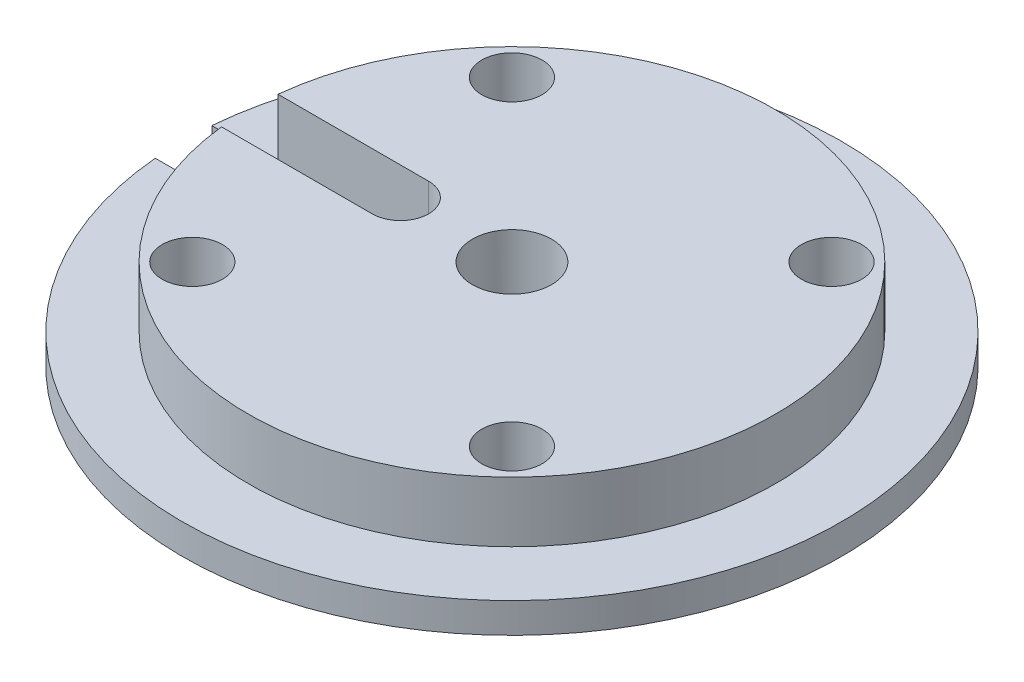
ISO-10303-21;
HEADER;
FILE_DESCRIPTION(('STEP AP214'),'2;1');
FILE_NAME('part.step','',(''),(''),'','','');
FILE_SCHEMA(('AUTOMOTIVE_DESIGN { 1 0 10303 214 1 1 1 1 }'));
ENDSEC;
DATA;
#1=APPLICATION_CONTEXT('core data for automotive mechanical design processes');
#2=APPLICATION_PROTOCOL_DEFINITION('international standard','automotive_design',2000,#1);
#3=PRODUCT_CONTEXT('',#1,'mechanical');
#4=PRODUCT('Part','Part','',(#3));
#5=PRODUCT_RELATED_PRODUCT_CATEGORY('part','',(#4));
#6=PRODUCT_DEFINITION_FORMATION('','',#4);
#7=PRODUCT_DEFINITION_CONTEXT('part definition',#1,'design');
#8=PRODUCT_DEFINITION('design','',#6,#7);
#9=PRODUCT_DEFINITION_SHAPE('','',#8);
#10=(LENGTH_UNIT() NAMED_UNIT(*) SI_UNIT(.MILLI.,.METRE.));
#11=(NAMED_UNIT(*) PLANE_ANGLE_UNIT() SI_UNIT($,.RADIAN.));
#12=(NAMED_UNIT(*) SI_UNIT($,.STERADIAN.) SOLID_ANGLE_UNIT());
#13=UNCERTAINTY_MEASURE_WITH_UNIT(LENGTH_MEASURE(1.E-05),#10,'distance_accuracy_value','');
#14=(GEOMETRIC_REPRESENTATION_CONTEXT(3) GLOBAL_UNCERTAINTY_ASSIGNED_CONTEXT((#13)) GLOBAL_UNIT_ASSIGNED_CONTEXT((#10,
#11,#12)) REPRESENTATION_CONTEXT('',''));
#15=CARTESIAN_POINT('',(0.,0.,0.));
#16=DIRECTION('',(0.,0.,1.));
#17=DIRECTION('',(1.,0.,0.));
#18=AXIS2_PLACEMENT_3D('',#15,#16,#17);
#19=CARTESIAN_POINT('',(0.,3.2,0.));
#20=DIRECTION('',(0.,1.,0.));
#21=DIRECTION('',(0.,0.,1.));
#22=AXIS2_PLACEMENT_3D('',#19,#20,#21);
#23=PLANE('',#22);
#24=CARTESIAN_POINT('',(-8.48528137423868,3.2,-8.48528137423846));
#25=DIRECTION('',(0.,-1.,0.));
#26=DIRECTION('',(0.,0.,1.));
#27=AXIS2_PLACEMENT_3D('',#24,#25,#26);
#28=CIRCLE('',#27,1.6);
#29=CARTESIAN_POINT('',(-8.48528137423868,3.2,-6.88528137423846));
#30=VERTEX_POINT('',#29);
#31=EDGE_CURVE('E316',#30,#30,#28,.T.);
#32=ORIENTED_EDGE('',*,*,#31,.T.);
#33=EDGE_LOOP('',(#32));
#34=FACE_BOUND('',#33,.T.);
#35=CARTESIAN_POINT('',(8.48528137423868,3.2,8.48528137423846));
#36=DIRECTION('',(0.,-1.,0.));
#37=DIRECTION('',(0.,0.,1.));
#38=AXIS2_PLACEMENT_3D('',#35,#36,#37);
#39=CIRCLE('',#38,1.6);
#40=CARTESIAN_POINT('',(8.48528137423868,3.2,10.0852813742385));
#41=VERTEX_POINT('',#40);
#42=EDGE_CURVE('E321',#41,#41,#39,.T.);
#43=ORIENTED_EDGE('',*,*,#42,.T.);
#44=EDGE_LOOP('',(#43));
#45=FACE_BOUND('',#44,.T.);
#46=CARTESIAN_POINT('',(8.48528137423867,3.2,-8.48528137423846));
#47=DIRECTION('',(0.,-1.,0.));
#48=DIRECTION('',(0.,0.,1.));
#49=AXIS2_PLACEMENT_3D('',#46,#47,#48);
#50=CIRCLE('',#49,1.6);
#51=CARTESIAN_POINT('',(8.48528137423867,3.2,-6.88528137423846));
#52=VERTEX_POINT('',#51);
#53=EDGE_CURVE('E311',#52,#52,#50,.T.);
#54=ORIENTED_EDGE('',*,*,#53,.T.);
#55=EDGE_LOOP('',(#54));
#56=FACE_BOUND('',#55,.T.);
#57=CARTESIAN_POINT('',(-8.48528137423868,3.2,8.48528137423846));
#58=DIRECTION('',(0.,-1.,0.));
#59=DIRECTION('',(0.,0.,-1.));
#60=AXIS2_PLACEMENT_3D('',#57,#58,#59);
#61=CIRCLE('',#60,1.6);
#62=CARTESIAN_POINT('',(-8.48528137423868,3.2,6.88528137423846));
#63=VERTEX_POINT('',#62);
#64=EDGE_CURVE('E305',#63,#63,#61,.T.);
#65=ORIENTED_EDGE('',*,*,#64,.T.);
#66=EDGE_LOOP('',(#65));
#67=FACE_BOUND('',#66,.T.);
#68=DIRECTION('',(-1.,0.,0.));
#69=VECTOR('',#68,1.);
#70=CARTESIAN_POINT('',(-13.9194109070751,3.2,-1.5));
#71=LINE('',#70,#69);
#72=CARTESIAN_POINT('',(-5.91941090707506,3.2,-1.5));
#73=VERTEX_POINT('',#72);
#74=CARTESIAN_POINT('',(-13.9194109070751,3.2,-1.5));
#75=VERTEX_POINT('',#74);
#76=EDGE_CURVE('E200',#73,#75,#71,.T.);
#77=ORIENTED_EDGE('',*,*,#76,.F.);
#78=CARTESIAN_POINT('',(-5.91941090707506,3.2,0.));
#79=DIRECTION('',(0.,1.,0.));
#80=DIRECTION('',(0.,0.,-1.));
#81=AXIS2_PLACEMENT_3D('',#78,#79,#80);
#82=CIRCLE('',#81,1.5);
#83=CARTESIAN_POINT('',(-5.91941090707506,3.2,1.5));
#84=VERTEX_POINT('',#83);
#85=EDGE_CURVE('E197',#84,#73,#82,.T.);
#86=ORIENTED_EDGE('',*,*,#85,.F.);
#87=DIRECTION('',(1.,0.,0.));
#88=VECTOR('',#87,1.);
#89=CARTESIAN_POINT('',(-13.9194109070751,3.2,1.5));
#90=LINE('',#89,#88);
#91=CARTESIAN_POINT('',(-13.9194109070751,3.2,1.5));
#92=VERTEX_POINT('',#91);
#93=EDGE_CURVE('E194',#92,#84,#90,.T.);
#94=ORIENTED_EDGE('',*,*,#93,.F.);
#95=CARTESIAN_POINT('',(0.,3.2,0.));
#96=DIRECTION('',(0.,1.,0.));
#97=DIRECTION('',(0.,0.,1.));
#98=AXIS2_PLACEMENT_3D('',#95,#96,#97);
#99=CIRCLE('',#98,14.);
#100=EDGE_CURVE('E214',#92,#75,#99,.T.);
#101=ORIENTED_EDGE('',*,*,#100,.T.);
#102=EDGE_LOOP('',(#77,#86,#94,#101));
#103=FACE_BOUND('',#102,.T.);
#104=CARTESIAN_POINT('',(0.,3.2,0.));
#105=DIRECTION('',(0.,1.,0.));
#106=DIRECTION('',(0.,0.,1.));
#107=AXIS2_PLACEMENT_3D('',#104,#105,#106);
#108=CIRCLE('',#107,2.1);
#109=CARTESIAN_POINT('',(0.,3.2,2.1));
#110=VERTEX_POINT('',#109);
#111=EDGE_CURVE('E210',#110,#110,#108,.T.);
#112=ORIENTED_EDGE('',*,*,#111,.F.);
#113=EDGE_LOOP('',(#112));
#114=FACE_BOUND('',#113,.T.);
#115=ADVANCED_FACE('F35',(#34,#45,#56,#67,#103,#114),#23,.T.);
#116=CARTESIAN_POINT('',(0.,3.2,0.));
#117=DIRECTION('',(0.,-1.,0.));
#118=DIRECTION('',(0.,0.,-1.));
#119=AXIS2_PLACEMENT_3D('',#116,#117,#118);
#120=CYLINDRICAL_SURFACE('',#119,14.);
#121=CARTESIAN_POINT('',(0.,0.,0.));
#122=DIRECTION('',(0.,1.,0.));
#123=DIRECTION('',(0.,0.,1.));
#124=AXIS2_PLACEMENT_3D('',#121,#122,#123);
#125=CIRCLE('',#124,14.);
#126=CARTESIAN_POINT('',(-13.9194109070751,0.,1.5));
#127=VERTEX_POINT('',#126);
#128=CARTESIAN_POINT('',(-13.9194109070751,0.,-1.5));
#129=VERTEX_POINT('',#128);
#130=EDGE_CURVE('E213',#127,#129,#125,.T.);
#131=ORIENTED_EDGE('',*,*,#130,.T.);
#132=DIRECTION('',(0.,-1.,0.));
#133=VECTOR('',#132,1.);
#134=CARTESIAN_POINT('',(-13.9194109070751,3.2,-1.5));
#135=LINE('',#134,#133);
#136=EDGE_CURVE('E43',#129,#75,#135,.F.);
#137=ORIENTED_EDGE('',*,*,#136,.T.);
#138=ORIENTED_EDGE('',*,*,#100,.F.);
#139=DIRECTION('',(0.,-1.,0.));
#140=VECTOR('',#139,1.);
#141=CARTESIAN_POINT('',(-13.9194109070751,3.2,1.5));
#142=LINE('',#141,#140);
#143=EDGE_CURVE('E217',#92,#127,#142,.T.);
#144=ORIENTED_EDGE('',*,*,#143,.T.);
#145=EDGE_LOOP('',(#131,#137,#138,#144));
#146=FACE_BOUND('',#145,.T.);
#147=ADVANCED_FACE('F37',(#146),#120,.T.);
#148=CARTESIAN_POINT('',(0.,3.2,0.));
#149=DIRECTION('',(0.,-1.,0.));
#150=DIRECTION('',(0.,0.,-1.));
#151=AXIS2_PLACEMENT_3D('',#148,#149,#150);
#152=CYLINDRICAL_SURFACE('',#151,2.1);
#153=ORIENTED_EDGE('',*,*,#111,.T.);
#154=EDGE_LOOP('',(#153));
#155=FACE_BOUND('',#154,.T.);
#156=CARTESIAN_POINT('',(0.,-1.6,0.));
#157=DIRECTION('',(0.,-1.,0.));
#158=DIRECTION('',(0.,0.,-1.));
#159=AXIS2_PLACEMENT_3D('',#156,#157,#158);
#160=CIRCLE('',#159,2.1);
#161=CARTESIAN_POINT('',(0.,-1.6,-2.1));
#162=VERTEX_POINT('',#161);
#163=EDGE_CURVE('E152',#162,#162,#160,.T.);
#164=ORIENTED_EDGE('',*,*,#163,.T.);
#165=EDGE_LOOP('',(#164));
#166=FACE_BOUND('',#165,.T.);
#167=ADVANCED_FACE('F249',(#155,#166),#152,.F.);
#168=CARTESIAN_POINT('',(-5.91941090707506,-6.8,0.));
#169=DIRECTION('',(0.,1.,0.));
#170=DIRECTION('',(0.,0.,1.));
#171=AXIS2_PLACEMENT_3D('',#168,#169,#170);
#172=CYLINDRICAL_SURFACE('',#171,1.5);
#173=DIRECTION('',(0.,1.,0.));
#174=VECTOR('',#173,1.);
#175=CARTESIAN_POINT('',(-5.91941090707506,-6.8,1.5));
#176=LINE('',#175,#174);
#177=CARTESIAN_POINT('',(-5.91941090707506,0.,1.5));
#178=VERTEX_POINT('',#177);
#179=EDGE_CURVE('E202',#178,#84,#176,.T.);
#180=ORIENTED_EDGE('',*,*,#179,.T.);
#181=ORIENTED_EDGE('',*,*,#85,.T.);
#182=DIRECTION('',(0.,1.,0.));
#183=VECTOR('',#182,1.);
#184=CARTESIAN_POINT('',(-5.91941090707506,-6.8,-1.5));
#185=LINE('',#184,#183);
#186=CARTESIAN_POINT('',(-5.91941090707506,0.,-1.5));
#187=VERTEX_POINT('',#186);
#188=EDGE_CURVE('E203',#187,#73,#185,.T.);
#189=ORIENTED_EDGE('',*,*,#188,.F.);
#190=CARTESIAN_POINT('',(-5.91941090707506,0.,0.));
#191=DIRECTION('',(0.,1.,0.));
#192=DIRECTION('',(0.,0.,1.));
#193=AXIS2_PLACEMENT_3D('',#190,#191,#192);
#194=CIRCLE('',#193,1.5);
#195=EDGE_CURVE('E11',#178,#187,#194,.T.);
#196=ORIENTED_EDGE('',*,*,#195,.F.);
#197=EDGE_LOOP('',(#180,#181,#189,#196));
#198=FACE_BOUND('',#197,.T.);
#199=ADVANCED_FACE('F247',(#198),#172,.F.);
#200=CARTESIAN_POINT('',(-13.9194109070751,-6.8,-1.5));
#201=DIRECTION('',(0.,0.,-1.));
#202=DIRECTION('',(-1.,0.,0.));
#203=AXIS2_PLACEMENT_3D('',#200,#201,#202);
#204=PLANE('',#203);
#205=ORIENTED_EDGE('',*,*,#188,.T.);
#206=ORIENTED_EDGE('',*,*,#76,.T.);
#207=ORIENTED_EDGE('',*,*,#136,.F.);
#208=DIRECTION('',(-1.,0.,0.));
#209=VECTOR('',#208,1.);
#210=CARTESIAN_POINT('',(0.,0.,-1.5));
#211=LINE('',#210,#209);
#212=EDGE_CURVE('E207',#187,#129,#211,.T.);
#213=ORIENTED_EDGE('',*,*,#212,.F.);
#214=EDGE_LOOP('',(#205,#206,#207,#213));
#215=FACE_BOUND('',#214,.T.);
#216=ADVANCED_FACE('F245',(#215),#204,.F.);
#217=CARTESIAN_POINT('',(-13.9194109070751,-6.8,1.5));
#218=DIRECTION('',(0.,0.,1.));
#219=DIRECTION('',(1.,0.,0.));
#220=AXIS2_PLACEMENT_3D('',#217,#218,#219);
#221=PLANE('',#220);
#222=ORIENTED_EDGE('',*,*,#143,.F.);
#223=ORIENTED_EDGE('',*,*,#93,.T.);
#224=ORIENTED_EDGE('',*,*,#179,.F.);
#225=DIRECTION('',(1.,0.,0.));
#226=VECTOR('',#225,1.);
#227=CARTESIAN_POINT('',(0.,0.,1.5));
#228=LINE('',#227,#226);
#229=EDGE_CURVE('E50',#127,#178,#228,.T.);
#230=ORIENTED_EDGE('',*,*,#229,.F.);
#231=EDGE_LOOP('',(#222,#223,#224,#230));
#232=FACE_BOUND('',#231,.T.);
#233=ADVANCED_FACE('F227',(#232),#221,.F.);
#234=CARTESIAN_POINT('',(0.,0.,0.));
#235=DIRECTION('',(0.,-1.,0.));
#236=DIRECTION('',(0.,0.,-1.));
#237=AXIS2_PLACEMENT_3D('',#234,#235,#236);
#238=PLANE('',#237);
#239=CARTESIAN_POINT('',(-5.91941090707506,0.,0.));
#240=DIRECTION('',(0.,-1.,0.));
#241=DIRECTION('',(0.,0.,-1.));
#242=AXIS2_PLACEMENT_3D('',#239,#240,#241);
#243=CIRCLE('',#242,0.8);
#244=CARTESIAN_POINT('',(-5.91941090707506,0.,-0.8));
#245=VERTEX_POINT('',#244);
#246=CARTESIAN_POINT('',(-5.91941090707506,0.,0.8));
#247=VERTEX_POINT('',#246);
#248=EDGE_CURVE('E150',#245,#247,#243,.T.);
#249=ORIENTED_EDGE('',*,*,#248,.T.);
#250=DIRECTION('',(-1.,0.,0.));
#251=VECTOR('',#250,1.);
#252=CARTESIAN_POINT('',(-5.91941090707506,0.,0.8));
#253=LINE('',#252,#251);
#254=CARTESIAN_POINT('',(-7.51941090707506,0.,0.8));
#255=VERTEX_POINT('',#254);
#256=EDGE_CURVE('E135',#247,#255,#253,.T.);
#257=ORIENTED_EDGE('',*,*,#256,.T.);
#258=CARTESIAN_POINT('',(-7.51941090707506,0.,0.));
#259=DIRECTION('',(0.,-1.,0.));
#260=DIRECTION('',(0.,0.,-1.));
#261=AXIS2_PLACEMENT_3D('',#258,#259,#260);
#262=CIRCLE('',#261,0.8);
#263=CARTESIAN_POINT('',(-7.51941090707506,0.,-0.8));
#264=VERTEX_POINT('',#263);
#265=EDGE_CURVE('E154',#255,#264,#262,.T.);
#266=ORIENTED_EDGE('',*,*,#265,.T.);
#267=DIRECTION('',(1.,0.,0.));
#268=VECTOR('',#267,1.);
#269=CARTESIAN_POINT('',(-5.91941090707506,0.,-0.8));
#270=LINE('',#269,#268);
#271=EDGE_CURVE('E129',#264,#245,#270,.T.);
#272=ORIENTED_EDGE('',*,*,#271,.T.);
#273=EDGE_LOOP('',(#249,#257,#266,#272));
#274=FACE_BOUND('',#273,.T.);
#275=ORIENTED_EDGE('',*,*,#229,.T.);
#276=ORIENTED_EDGE('',*,*,#195,.T.);
#277=ORIENTED_EDGE('',*,*,#212,.T.);
#278=CARTESIAN_POINT('',(-13.9194109070751,0.,0.));
#279=DIRECTION('',(0.,1.,0.));
#280=DIRECTION('',(0.,0.,1.));
#281=AXIS2_PLACEMENT_3D('',#278,#279,#280);
#282=CIRCLE('',#281,1.5);
#283=EDGE_CURVE('E179',#127,#129,#282,.T.);
#284=ORIENTED_EDGE('',*,*,#283,.F.);
#285=EDGE_LOOP('',(#275,#276,#277,#284));
#286=FACE_BOUND('',#285,.T.);
#287=ADVANCED_FACE('F243',(#274,#286),#238,.F.);
#288=CARTESIAN_POINT('',(0.,-1.6,0.));
#289=DIRECTION('',(0.,-1.,0.));
#290=DIRECTION('',(0.,0.,-1.));
#291=AXIS2_PLACEMENT_3D('',#288,#289,#290);
#292=PLANE('',#291);
#293=CARTESIAN_POINT('',(-8.48528137423868,-1.6,-8.48528137423846));
#294=DIRECTION('',(0.,-1.,0.));
#295=DIRECTION('',(0.,0.,1.));
#296=AXIS2_PLACEMENT_3D('',#293,#294,#295);
#297=CIRCLE('',#296,1.6);
#298=CARTESIAN_POINT('',(-8.48528137423868,-1.6,-6.88528137423846));
#299=VERTEX_POINT('',#298);
#300=EDGE_CURVE('E313',#299,#299,#297,.T.);
#301=ORIENTED_EDGE('',*,*,#300,.F.);
#302=EDGE_LOOP('',(#301));
#303=FACE_BOUND('',#302,.T.);
#304=CARTESIAN_POINT('',(8.48528137423868,-1.6,8.48528137423846));
#305=DIRECTION('',(0.,-1.,0.));
#306=DIRECTION('',(0.,0.,1.));
#307=AXIS2_PLACEMENT_3D('',#304,#305,#306);
#308=CIRCLE('',#307,1.6);
#309=CARTESIAN_POINT('',(8.48528137423868,-1.6,10.0852813742385));
#310=VERTEX_POINT('',#309);
#311=EDGE_CURVE('E318',#310,#310,#308,.T.);
#312=ORIENTED_EDGE('',*,*,#311,.F.);
#313=EDGE_LOOP('',(#312));
#314=FACE_BOUND('',#313,.T.);
#315=CARTESIAN_POINT('',(8.48528137423867,-1.6,-8.48528137423846));
#316=DIRECTION('',(0.,-1.,0.));
#317=DIRECTION('',(0.,0.,1.));
#318=AXIS2_PLACEMENT_3D('',#315,#316,#317);
#319=CIRCLE('',#318,1.6);
#320=CARTESIAN_POINT('',(8.48528137423867,-1.6,-6.88528137423846));
#321=VERTEX_POINT('',#320);
#322=EDGE_CURVE('E324',#321,#321,#319,.T.);
#323=ORIENTED_EDGE('',*,*,#322,.F.);
#324=EDGE_LOOP('',(#323));
#325=FACE_BOUND('',#324,.T.);
#326=CARTESIAN_POINT('',(-8.48528137423868,-1.6,8.48528137423846));
#327=DIRECTION('',(0.,-1.,0.));
#328=DIRECTION('',(0.,0.,-1.));
#329=AXIS2_PLACEMENT_3D('',#326,#327,#328);
#330=CIRCLE('',#329,1.6);
#331=CARTESIAN_POINT('',(-8.48528137423868,-1.6,6.88528137423846));
#332=VERTEX_POINT('',#331);
#333=EDGE_CURVE('E307',#332,#332,#330,.T.);
#334=ORIENTED_EDGE('',*,*,#333,.F.);
#335=EDGE_LOOP('',(#334));
#336=FACE_BOUND('',#335,.T.);
#337=DIRECTION('',(-1.,0.,0.));
#338=VECTOR('',#337,1.);
#339=CARTESIAN_POINT('',(-5.91941090707506,-1.6,0.8));
#340=LINE('',#339,#338);
#341=CARTESIAN_POINT('',(-5.91941090707506,-1.6,0.8));
#342=VERTEX_POINT('',#341);
#343=CARTESIAN_POINT('',(-7.51941090707506,-1.6,0.8));
#344=VERTEX_POINT('',#343);
#345=EDGE_CURVE('E128',#342,#344,#340,.T.);
#346=ORIENTED_EDGE('',*,*,#345,.F.);
#347=CARTESIAN_POINT('',(-5.91941090707506,-1.6,0.));
#348=DIRECTION('',(0.,-1.,0.));
#349=DIRECTION('',(0.,0.,-1.));
#350=AXIS2_PLACEMENT_3D('',#347,#348,#349);
#351=CIRCLE('',#350,0.8);
#352=CARTESIAN_POINT('',(-5.91941090707506,-1.6,-0.8));
#353=VERTEX_POINT('',#352);
#354=EDGE_CURVE('E118',#353,#342,#351,.T.);
#355=ORIENTED_EDGE('',*,*,#354,.F.);
#356=DIRECTION('',(1.,0.,0.));
#357=VECTOR('',#356,1.);
#358=CARTESIAN_POINT('',(-5.91941090707506,-1.6,-0.8));
#359=LINE('',#358,#357);
#360=CARTESIAN_POINT('',(-7.51941090707506,-1.6,-0.8));
#361=VERTEX_POINT('',#360);
#362=EDGE_CURVE('E145',#361,#353,#359,.T.);
#363=ORIENTED_EDGE('',*,*,#362,.F.);
#364=CARTESIAN_POINT('',(-7.51941090707506,-1.6,0.));
#365=DIRECTION('',(0.,-1.,0.));
#366=DIRECTION('',(0.,0.,-1.));
#367=AXIS2_PLACEMENT_3D('',#364,#365,#366);
#368=CIRCLE('',#367,0.8);
#369=EDGE_CURVE('E143',#344,#361,#368,.T.);
#370=ORIENTED_EDGE('',*,*,#369,.F.);
#371=EDGE_LOOP('',(#346,#355,#363,#370));
#372=FACE_BOUND('',#371,.T.);
#373=CARTESIAN_POINT('',(0.,-1.6,0.));
#374=DIRECTION('',(0.,-1.,0.));
#375=DIRECTION('',(0.,0.,-1.));
#376=AXIS2_PLACEMENT_3D('',#373,#374,#375);
#377=CIRCLE('',#376,17.5);
#378=CARTESIAN_POINT('',(-17.4355957741627,-1.6,-1.5));
#379=VERTEX_POINT('',#378);
#380=CARTESIAN_POINT('',(-17.4355957741627,-1.6,1.5));
#381=VERTEX_POINT('',#380);
#382=EDGE_CURVE('E163',#379,#381,#377,.T.);
#383=ORIENTED_EDGE('',*,*,#382,.T.);
#384=DIRECTION('',(1.,0.,0.));
#385=VECTOR('',#384,1.);
#386=CARTESIAN_POINT('',(-13.9194109070751,-1.6,1.5));
#387=LINE('',#386,#385);
#388=CARTESIAN_POINT('',(-13.9194109070751,-1.6,1.5));
#389=VERTEX_POINT('',#388);
#390=EDGE_CURVE('E166',#381,#389,#387,.T.);
#391=ORIENTED_EDGE('',*,*,#390,.T.);
#392=CARTESIAN_POINT('',(-13.9194109070751,-1.6,0.));
#393=DIRECTION('',(0.,1.,0.));
#394=DIRECTION('',(0.,0.,1.));
#395=AXIS2_PLACEMENT_3D('',#392,#393,#394);
#396=CIRCLE('',#395,1.5);
#397=CARTESIAN_POINT('',(-13.9194109070751,-1.6,-1.5));
#398=VERTEX_POINT('',#397);
#399=EDGE_CURVE('E169',#389,#398,#396,.T.);
#400=ORIENTED_EDGE('',*,*,#399,.T.);
#401=DIRECTION('',(-1.,0.,0.));
#402=VECTOR('',#401,1.);
#403=CARTESIAN_POINT('',(-17.4355957741627,-1.6,-1.5));
#404=LINE('',#403,#402);
#405=EDGE_CURVE('E171',#398,#379,#404,.T.);
#406=ORIENTED_EDGE('',*,*,#405,.T.);
#407=EDGE_LOOP('',(#383,#391,#400,#406));
#408=FACE_BOUND('',#407,.T.);
#409=ORIENTED_EDGE('',*,*,#163,.F.);
#410=EDGE_LOOP('',(#409));
#411=FACE_BOUND('',#410,.T.);
#412=ADVANCED_FACE('F140',(#303,#314,#325,#336,#372,#408,#411),#292,.T.);
#413=ORIENTED_EDGE('',*,*,#130,.F.);
#414=DIRECTION('',(1.,0.,0.));
#415=VECTOR('',#414,1.);
#416=CARTESIAN_POINT('',(-13.9194109070751,0.,1.5));
#417=LINE('',#416,#415);
#418=CARTESIAN_POINT('',(-17.4355957741627,0.,1.5));
#419=VERTEX_POINT('',#418);
#420=EDGE_CURVE('E176',#419,#127,#417,.T.);
#421=ORIENTED_EDGE('',*,*,#420,.F.);
#422=CARTESIAN_POINT('',(0.,0.,0.));
#423=DIRECTION('',(0.,-1.,0.));
#424=DIRECTION('',(0.,0.,-1.));
#425=AXIS2_PLACEMENT_3D('',#422,#423,#424);
#426=CIRCLE('',#425,17.5);
#427=CARTESIAN_POINT('',(-17.4355957741627,0.,-1.5));
#428=VERTEX_POINT('',#427);
#429=EDGE_CURVE('E136',#428,#419,#426,.T.);
#430=ORIENTED_EDGE('',*,*,#429,.F.);
#431=DIRECTION('',(-1.,0.,0.));
#432=VECTOR('',#431,1.);
#433=CARTESIAN_POINT('',(-17.4355957741627,0.,-1.5));
#434=LINE('',#433,#432);
#435=EDGE_CURVE('E167',#129,#428,#434,.T.);
#436=ORIENTED_EDGE('',*,*,#435,.F.);
#437=EDGE_LOOP('',(#413,#421,#430,#436));
#438=FACE_BOUND('',#437,.T.);
#439=ADVANCED_FACE('F231',(#438),#238,.F.);
#440=CARTESIAN_POINT('',(0.,-1.6,0.));
#441=DIRECTION('',(0.,1.,0.));
#442=DIRECTION('',(0.,0.,1.));
#443=AXIS2_PLACEMENT_3D('',#440,#441,#442);
#444=CYLINDRICAL_SURFACE('',#443,17.5);
#445=ORIENTED_EDGE('',*,*,#429,.T.);
#446=DIRECTION('',(0.,1.,0.));
#447=VECTOR('',#446,1.);
#448=CARTESIAN_POINT('',(-17.4355957741627,-1.6,1.5));
#449=LINE('',#448,#447);
#450=EDGE_CURVE('E191',#381,#419,#449,.T.);
#451=ORIENTED_EDGE('',*,*,#450,.F.);
#452=ORIENTED_EDGE('',*,*,#382,.F.);
#453=DIRECTION('',(0.,1.,0.));
#454=VECTOR('',#453,1.);
#455=CARTESIAN_POINT('',(-17.4355957741627,-1.6,-1.5));
#456=LINE('',#455,#454);
#457=EDGE_CURVE('E173',#379,#428,#456,.T.);
#458=ORIENTED_EDGE('',*,*,#457,.T.);
#459=EDGE_LOOP('',(#445,#451,#452,#458));
#460=FACE_BOUND('',#459,.T.);
#461=ADVANCED_FACE('F279',(#460),#444,.T.);
#462=CARTESIAN_POINT('',(-13.9194109070751,-1.6,1.5));
#463=DIRECTION('',(0.,0.,1.));
#464=DIRECTION('',(1.,0.,0.));
#465=AXIS2_PLACEMENT_3D('',#462,#463,#464);
#466=PLANE('',#465);
#467=ORIENTED_EDGE('',*,*,#420,.T.);
#468=DIRECTION('',(0.,1.,0.));
#469=VECTOR('',#468,1.);
#470=CARTESIAN_POINT('',(-13.9194109070751,-1.6,1.5));
#471=LINE('',#470,#469);
#472=EDGE_CURVE('E188',#389,#127,#471,.T.);
#473=ORIENTED_EDGE('',*,*,#472,.F.);
#474=ORIENTED_EDGE('',*,*,#390,.F.);
#475=ORIENTED_EDGE('',*,*,#450,.T.);
#476=EDGE_LOOP('',(#467,#473,#474,#475));
#477=FACE_BOUND('',#476,.T.);
#478=ADVANCED_FACE('F235',(#477),#466,.F.);
#479=CARTESIAN_POINT('',(-13.9194109070751,-1.6,0.));
#480=DIRECTION('',(0.,1.,0.));
#481=DIRECTION('',(0.,0.,1.));
#482=AXIS2_PLACEMENT_3D('',#479,#480,#481);
#483=CYLINDRICAL_SURFACE('',#482,1.5);
#484=ORIENTED_EDGE('',*,*,#283,.T.);
#485=DIRECTION('',(0.,1.,0.));
#486=VECTOR('',#485,1.);
#487=CARTESIAN_POINT('',(-13.9194109070751,-1.6,-1.5));
#488=LINE('',#487,#486);
#489=EDGE_CURVE('E185',#398,#129,#488,.T.);
#490=ORIENTED_EDGE('',*,*,#489,.F.);
#491=ORIENTED_EDGE('',*,*,#399,.F.);
#492=ORIENTED_EDGE('',*,*,#472,.T.);
#493=EDGE_LOOP('',(#484,#490,#491,#492));
#494=FACE_BOUND('',#493,.T.);
#495=ADVANCED_FACE('F240',(#494),#483,.F.);
#496=CARTESIAN_POINT('',(-17.4355957741627,-1.6,-1.5));
#497=DIRECTION('',(0.,0.,-1.));
#498=DIRECTION('',(-1.,0.,0.));
#499=AXIS2_PLACEMENT_3D('',#496,#497,#498);
#500=PLANE('',#499);
#501=ORIENTED_EDGE('',*,*,#435,.T.);
#502=ORIENTED_EDGE('',*,*,#457,.F.);
#503=ORIENTED_EDGE('',*,*,#405,.F.);
#504=ORIENTED_EDGE('',*,*,#489,.T.);
#505=EDGE_LOOP('',(#501,#502,#503,#504));
#506=FACE_BOUND('',#505,.T.);
#507=ADVANCED_FACE('F291',(#506),#500,.F.);
#508=CARTESIAN_POINT('',(-5.91941090707506,-1.6,0.));
#509=DIRECTION('',(0.,1.,0.));
#510=DIRECTION('',(0.,0.,1.));
#511=AXIS2_PLACEMENT_3D('',#508,#509,#510);
#512=CYLINDRICAL_SURFACE('',#511,0.8);
#513=ORIENTED_EDGE('',*,*,#248,.F.);
#514=DIRECTION('',(0.,1.,0.));
#515=VECTOR('',#514,1.);
#516=CARTESIAN_POINT('',(-5.91941090707506,-1.6,-0.8));
#517=LINE('',#516,#515);
#518=EDGE_CURVE('E124',#353,#245,#517,.T.);
#519=ORIENTED_EDGE('',*,*,#518,.F.);
#520=ORIENTED_EDGE('',*,*,#354,.T.);
#521=DIRECTION('',(0.,1.,0.));
#522=VECTOR('',#521,1.);
#523=CARTESIAN_POINT('',(-5.91941090707506,-1.6,0.8));
#524=LINE('',#523,#522);
#525=EDGE_CURVE('E121',#342,#247,#524,.T.);
#526=ORIENTED_EDGE('',*,*,#525,.T.);
#527=EDGE_LOOP('',(#513,#519,#520,#526));
#528=FACE_BOUND('',#527,.T.);
#529=ADVANCED_FACE('F120',(#528),#512,.F.);
#530=CARTESIAN_POINT('',(-5.91941090707506,-1.6,0.8));
#531=DIRECTION('',(0.,0.,-1.));
#532=DIRECTION('',(-1.,0.,0.));
#533=AXIS2_PLACEMENT_3D('',#530,#531,#532);
#534=PLANE('',#533);
#535=ORIENTED_EDGE('',*,*,#256,.F.);
#536=ORIENTED_EDGE('',*,*,#525,.F.);
#537=ORIENTED_EDGE('',*,*,#345,.T.);
#538=DIRECTION('',(0.,1.,0.));
#539=VECTOR('',#538,1.);
#540=CARTESIAN_POINT('',(-7.51941090707506,-1.6,0.8));
#541=LINE('',#540,#539);
#542=EDGE_CURVE('E137',#344,#255,#541,.T.);
#543=ORIENTED_EDGE('',*,*,#542,.T.);
#544=EDGE_LOOP('',(#535,#536,#537,#543));
#545=FACE_BOUND('',#544,.T.);
#546=ADVANCED_FACE('F132',(#545),#534,.T.);
#547=CARTESIAN_POINT('',(-7.51941090707506,-1.6,0.));
#548=DIRECTION('',(0.,1.,0.));
#549=DIRECTION('',(0.,0.,1.));
#550=AXIS2_PLACEMENT_3D('',#547,#548,#549);
#551=CYLINDRICAL_SURFACE('',#550,0.8);
#552=ORIENTED_EDGE('',*,*,#265,.F.);
#553=ORIENTED_EDGE('',*,*,#542,.F.);
#554=ORIENTED_EDGE('',*,*,#369,.T.);
#555=DIRECTION('',(0.,1.,0.));
#556=VECTOR('',#555,1.);
#557=CARTESIAN_POINT('',(-7.51941090707506,-1.6,-0.8));
#558=LINE('',#557,#556);
#559=EDGE_CURVE('E160',#361,#264,#558,.T.);
#560=ORIENTED_EDGE('',*,*,#559,.T.);
#561=EDGE_LOOP('',(#552,#553,#554,#560));
#562=FACE_BOUND('',#561,.T.);
#563=ADVANCED_FACE('F350',(#562),#551,.F.);
#564=CARTESIAN_POINT('',(-5.91941090707506,-1.6,-0.8));
#565=DIRECTION('',(0.,0.,1.));
#566=DIRECTION('',(1.,0.,0.));
#567=AXIS2_PLACEMENT_3D('',#564,#565,#566);
#568=PLANE('',#567);
#569=ORIENTED_EDGE('',*,*,#271,.F.);
#570=ORIENTED_EDGE('',*,*,#559,.F.);
#571=ORIENTED_EDGE('',*,*,#362,.T.);
#572=ORIENTED_EDGE('',*,*,#518,.T.);
#573=EDGE_LOOP('',(#569,#570,#571,#572));
#574=FACE_BOUND('',#573,.T.);
#575=ADVANCED_FACE('F344',(#574),#568,.T.);
#576=CARTESIAN_POINT('',(-8.48528137423868,3.2,8.48528137423846));
#577=DIRECTION('',(0.,-1.,0.));
#578=DIRECTION('',(0.,0.,-1.));
#579=AXIS2_PLACEMENT_3D('',#576,#577,#578);
#580=CYLINDRICAL_SURFACE('',#579,1.6);
#581=ORIENTED_EDGE('',*,*,#64,.F.);
#582=EDGE_LOOP('',(#581));
#583=FACE_BOUND('',#582,.T.);
#584=ORIENTED_EDGE('',*,*,#333,.T.);
#585=EDGE_LOOP('',(#584));
#586=FACE_BOUND('',#585,.T.);
#587=ADVANCED_FACE('F336',(#583,#586),#580,.F.);
#588=CARTESIAN_POINT('',(8.48528137423867,3.2,-8.48528137423846));
#589=DIRECTION('',(0.,-1.,0.));
#590=DIRECTION('',(0.,0.,-1.));
#591=AXIS2_PLACEMENT_3D('',#588,#589,#590);
#592=CYLINDRICAL_SURFACE('',#591,1.6);
#593=ORIENTED_EDGE('',*,*,#53,.F.);
#594=EDGE_LOOP('',(#593));
#595=FACE_BOUND('',#594,.T.);
#596=ORIENTED_EDGE('',*,*,#322,.T.);
#597=EDGE_LOOP('',(#596));
#598=FACE_BOUND('',#597,.T.);
#599=ADVANCED_FACE('F332',(#595,#598),#592,.F.);
#600=CARTESIAN_POINT('',(8.48528137423868,3.2,8.48528137423846));
#601=DIRECTION('',(0.,-1.,0.));
#602=DIRECTION('',(0.,0.,-1.));
#603=AXIS2_PLACEMENT_3D('',#600,#601,#602);
#604=CYLINDRICAL_SURFACE('',#603,1.6);
#605=ORIENTED_EDGE('',*,*,#42,.F.);
#606=EDGE_LOOP('',(#605));
#607=FACE_BOUND('',#606,.T.);
#608=ORIENTED_EDGE('',*,*,#311,.T.);
#609=EDGE_LOOP('',(#608));
#610=FACE_BOUND('',#609,.T.);
#611=ADVANCED_FACE('F335',(#607,#610),#604,.F.);
#612=CARTESIAN_POINT('',(-8.48528137423868,3.2,-8.48528137423846));
#613=DIRECTION('',(0.,-1.,0.));
#614=DIRECTION('',(0.,0.,-1.));
#615=AXIS2_PLACEMENT_3D('',#612,#613,#614);
#616=CYLINDRICAL_SURFACE('',#615,1.6);
#617=ORIENTED_EDGE('',*,*,#31,.F.);
#618=EDGE_LOOP('',(#617));
#619=FACE_BOUND('',#618,.T.);
#620=ORIENTED_EDGE('',*,*,#300,.T.);
#621=EDGE_LOOP('',(#620));
#622=FACE_BOUND('',#621,.T.);
#623=ADVANCED_FACE('F355',(#619,#622),#616,.F.);
#624=CLOSED_SHELL('',(#115,#147,#167,#199,#216,#233,#287,#412,#439,#461,#478,#495,#507,#529,
#546,#563,#575,#587,#599,#611,#623));
#625=MANIFOLD_SOLID_BREP('B2',#624);
#626=ADVANCED_BREP_SHAPE_REPRESENTATION('',(#18,#625),#14);
#627=SHAPE_DEFINITION_REPRESENTATION(#9,#626);
ENDSEC;
END-ISO-10303-21;
